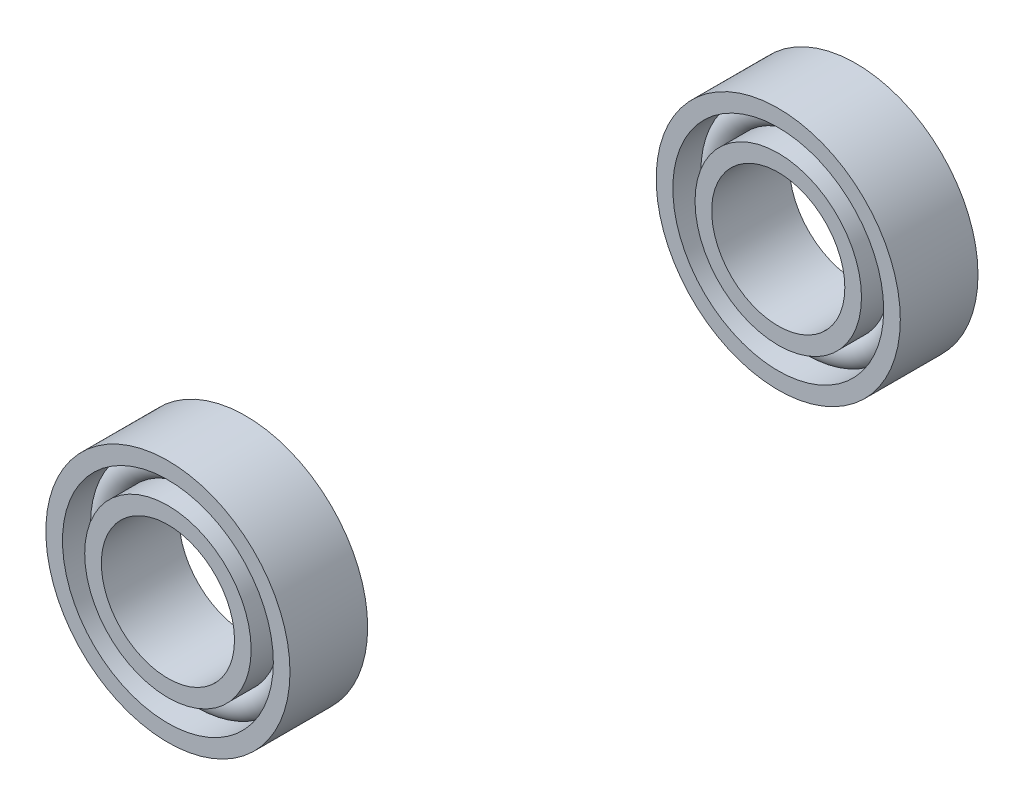
ISO-10303-21;
HEADER;
FILE_DESCRIPTION(('STEP AP214'),'2;1');
FILE_NAME('part.step','',(''),(''),'','','');
FILE_SCHEMA(('AUTOMOTIVE_DESIGN { 1 0 10303 214 1 1 1 1 }'));
ENDSEC;
DATA;
#1=APPLICATION_CONTEXT('core data for automotive mechanical design processes');
#2=APPLICATION_PROTOCOL_DEFINITION('international standard','automotive_design',2000,#1);
#3=PRODUCT_CONTEXT('',#1,'mechanical');
#4=PRODUCT('Part','Part','',(#3));
#5=PRODUCT_RELATED_PRODUCT_CATEGORY('part','',(#4));
#6=PRODUCT_DEFINITION_FORMATION('','',#4);
#7=PRODUCT_DEFINITION_CONTEXT('part definition',#1,'design');
#8=PRODUCT_DEFINITION('design','',#6,#7);
#9=PRODUCT_DEFINITION_SHAPE('','',#8);
#10=(LENGTH_UNIT() NAMED_UNIT(*) SI_UNIT(.MILLI.,.METRE.));
#11=(NAMED_UNIT(*) PLANE_ANGLE_UNIT() SI_UNIT($,.RADIAN.));
#12=(NAMED_UNIT(*) SI_UNIT($,.STERADIAN.) SOLID_ANGLE_UNIT());
#13=UNCERTAINTY_MEASURE_WITH_UNIT(LENGTH_MEASURE(1.E-05),#10,'distance_accuracy_value','');
#14=(GEOMETRIC_REPRESENTATION_CONTEXT(3) GLOBAL_UNCERTAINTY_ASSIGNED_CONTEXT((#13)) GLOBAL_UNIT_ASSIGNED_CONTEXT((#10,
#11,#12)) REPRESENTATION_CONTEXT('',''));
#15=CARTESIAN_POINT('',(0.,0.,0.));
#16=DIRECTION('',(0.,0.,1.));
#17=DIRECTION('',(1.,0.,0.));
#18=AXIS2_PLACEMENT_3D('',#15,#16,#17);
#19=CARTESIAN_POINT('',(-172.5,0.,-143.));
#20=DIRECTION('',(0.,0.,1.));
#21=DIRECTION('',(1.,0.,0.));
#22=AXIS2_PLACEMENT_3D('',#19,#20,#21);
#23=TOROIDAL_SURFACE('',#22,8.50000000000001,1.40000000000001);
#24=CARTESIAN_POINT('',(-172.5,0.,-142.020204102887));
#25=DIRECTION('',(0.,0.,-1.));
#26=DIRECTION('',(-1.,0.,0.));
#27=AXIS2_PLACEMENT_3D('',#24,#25,#26);
#28=CIRCLE('',#27,7.50000000000001);
#29=CARTESIAN_POINT('',(-180.,0.,-142.020204102887));
#30=VERTEX_POINT('',#29);
#31=EDGE_CURVE('E50',#30,#30,#28,.T.);
#32=ORIENTED_EDGE('',*,*,#31,.T.);
#33=EDGE_LOOP('',(#32));
#34=FACE_BOUND('',#33,.T.);
#35=CARTESIAN_POINT('',(-172.5,0.,-142.020204102887));
#36=DIRECTION('',(0.,0.,-1.));
#37=DIRECTION('',(-1.,0.,0.));
#38=AXIS2_PLACEMENT_3D('',#35,#36,#37);
#39=CIRCLE('',#38,9.50000000000001);
#40=CARTESIAN_POINT('',(-182.,0.,-142.020204102887));
#41=VERTEX_POINT('',#40);
#42=EDGE_CURVE('E11',#41,#41,#39,.T.);
#43=ORIENTED_EDGE('',*,*,#42,.F.);
#44=EDGE_LOOP('',(#43));
#45=FACE_BOUND('',#44,.T.);
#46=ADVANCED_FACE('F39',(#34,#45),#23,.T.);
#47=CARTESIAN_POINT('',(-172.5,0.,-143.979795897113));
#48=DIRECTION('',(0.,0.,1.));
#49=DIRECTION('',(1.,0.,0.));
#50=AXIS2_PLACEMENT_3D('',#47,#48,#49);
#51=CIRCLE('',#50,7.50000000000001);
#52=CARTESIAN_POINT('',(-165.,0.,-143.979795897113));
#53=VERTEX_POINT('',#52);
#54=EDGE_CURVE('E54',#53,#53,#51,.T.);
#55=ORIENTED_EDGE('',*,*,#54,.T.);
#56=EDGE_LOOP('',(#55));
#57=FACE_BOUND('',#56,.T.);
#58=CARTESIAN_POINT('',(-172.5,0.,-143.979795897113));
#59=DIRECTION('',(0.,0.,1.));
#60=DIRECTION('',(1.,0.,0.));
#61=AXIS2_PLACEMENT_3D('',#58,#59,#60);
#62=CIRCLE('',#61,9.50000000000001);
#63=CARTESIAN_POINT('',(-163.,0.,-143.979795897113));
#64=VERTEX_POINT('',#63);
#65=EDGE_CURVE('E46',#64,#64,#62,.T.);
#66=ORIENTED_EDGE('',*,*,#65,.F.);
#67=EDGE_LOOP('',(#66));
#68=FACE_BOUND('',#67,.T.);
#69=ADVANCED_FACE('F102',(#57,#68),#23,.T.);
#70=CARTESIAN_POINT('',(-172.5,0.,-134.5));
#71=DIRECTION('',(0.,0.,1.));
#72=DIRECTION('',(1.,0.,0.));
#73=AXIS2_PLACEMENT_3D('',#70,#71,#72);
#74=CYLINDRICAL_SURFACE('',#73,7.50000000000001);
#75=CARTESIAN_POINT('',(-172.5,0.,-139.5));
#76=DIRECTION('',(0.,0.,1.));
#77=DIRECTION('',(1.,0.,0.));
#78=AXIS2_PLACEMENT_3D('',#75,#76,#77);
#79=CIRCLE('',#78,7.50000000000001);
#80=CARTESIAN_POINT('',(-165.,0.,-139.5));
#81=VERTEX_POINT('',#80);
#82=EDGE_CURVE('E62',#81,#81,#79,.T.);
#83=ORIENTED_EDGE('',*,*,#82,.F.);
#84=EDGE_LOOP('',(#83));
#85=FACE_BOUND('',#84,.T.);
#86=ORIENTED_EDGE('',*,*,#31,.F.);
#87=EDGE_LOOP('',(#86));
#88=FACE_BOUND('',#87,.T.);
#89=ADVANCED_FACE('F107',(#85,#88),#74,.T.);
#90=CARTESIAN_POINT('',(-172.5,0.,-146.5));
#91=DIRECTION('',(0.,0.,1.));
#92=DIRECTION('',(1.,0.,0.));
#93=AXIS2_PLACEMENT_3D('',#90,#91,#92);
#94=CIRCLE('',#93,7.50000000000001);
#95=CARTESIAN_POINT('',(-165.,0.,-146.5));
#96=VERTEX_POINT('',#95);
#97=EDGE_CURVE('E65',#96,#96,#94,.T.);
#98=ORIENTED_EDGE('',*,*,#97,.T.);
#99=EDGE_LOOP('',(#98));
#100=FACE_BOUND('',#99,.T.);
#101=ORIENTED_EDGE('',*,*,#54,.F.);
#102=EDGE_LOOP('',(#101));
#103=FACE_BOUND('',#102,.T.);
#104=ADVANCED_FACE('F116',(#100,#103),#74,.T.);
#105=CARTESIAN_POINT('',(-172.5,0.,-134.5));
#106=DIRECTION('',(0.,0.,1.));
#107=DIRECTION('',(1.,0.,0.));
#108=AXIS2_PLACEMENT_3D('',#105,#106,#107);
#109=CYLINDRICAL_SURFACE('',#108,6.00000000000001);
#110=CARTESIAN_POINT('',(-172.5,0.,-146.5));
#111=DIRECTION('',(0.,0.,1.));
#112=DIRECTION('',(1.,0.,0.));
#113=AXIS2_PLACEMENT_3D('',#110,#111,#112);
#114=CIRCLE('',#113,6.00000000000001);
#115=CARTESIAN_POINT('',(-166.5,0.,-146.5));
#116=VERTEX_POINT('',#115);
#117=EDGE_CURVE('E68',#116,#116,#114,.T.);
#118=ORIENTED_EDGE('',*,*,#117,.F.);
#119=EDGE_LOOP('',(#118));
#120=FACE_BOUND('',#119,.T.);
#121=CARTESIAN_POINT('',(-172.5,0.,-139.5));
#122=DIRECTION('',(0.,0.,1.));
#123=DIRECTION('',(1.,0.,0.));
#124=AXIS2_PLACEMENT_3D('',#121,#122,#123);
#125=CIRCLE('',#124,6.00000000000001);
#126=CARTESIAN_POINT('',(-166.5,0.,-139.5));
#127=VERTEX_POINT('',#126);
#128=EDGE_CURVE('E59',#127,#127,#125,.T.);
#129=ORIENTED_EDGE('',*,*,#128,.T.);
#130=EDGE_LOOP('',(#129));
#131=FACE_BOUND('',#130,.T.);
#132=ADVANCED_FACE('F41',(#120,#131),#109,.F.);
#133=CARTESIAN_POINT('',(-178.5,0.,-139.5));
#134=DIRECTION('',(0.,0.,-1.));
#135=DIRECTION('',(-1.,0.,0.));
#136=AXIS2_PLACEMENT_3D('',#133,#134,#135);
#137=PLANE('',#136);
#138=ORIENTED_EDGE('',*,*,#128,.F.);
#139=EDGE_LOOP('',(#138));
#140=FACE_BOUND('',#139,.T.);
#141=ORIENTED_EDGE('',*,*,#82,.T.);
#142=EDGE_LOOP('',(#141));
#143=FACE_BOUND('',#142,.T.);
#144=ADVANCED_FACE('F113',(#140,#143),#137,.F.);
#145=CARTESIAN_POINT('',(-180.,0.,-146.5));
#146=DIRECTION('',(0.,0.,1.));
#147=DIRECTION('',(1.,0.,0.));
#148=AXIS2_PLACEMENT_3D('',#145,#146,#147);
#149=PLANE('',#148);
#150=ORIENTED_EDGE('',*,*,#97,.F.);
#151=EDGE_LOOP('',(#150));
#152=FACE_BOUND('',#151,.T.);
#153=ORIENTED_EDGE('',*,*,#117,.T.);
#154=EDGE_LOOP('',(#153));
#155=FACE_BOUND('',#154,.T.);
#156=ADVANCED_FACE('F98',(#152,#155),#149,.F.);
#157=CARTESIAN_POINT('',(-172.5,0.,-134.5));
#158=DIRECTION('',(0.,0.,1.));
#159=DIRECTION('',(1.,0.,0.));
#160=AXIS2_PLACEMENT_3D('',#157,#158,#159);
#161=CYLINDRICAL_SURFACE('',#160,9.50000000000001);
#162=CARTESIAN_POINT('',(-172.5,0.,-139.5));
#163=DIRECTION('',(0.,0.,1.));
#164=DIRECTION('',(1.,0.,0.));
#165=AXIS2_PLACEMENT_3D('',#162,#163,#164);
#166=CIRCLE('',#165,9.50000000000001);
#167=CARTESIAN_POINT('',(-163.,0.,-139.5));
#168=VERTEX_POINT('',#167);
#169=EDGE_CURVE('E71',#168,#168,#166,.T.);
#170=ORIENTED_EDGE('',*,*,#169,.T.);
#171=EDGE_LOOP('',(#170));
#172=FACE_BOUND('',#171,.T.);
#173=ORIENTED_EDGE('',*,*,#42,.T.);
#174=EDGE_LOOP('',(#173));
#175=FACE_BOUND('',#174,.T.);
#176=ADVANCED_FACE('F89',(#172,#175),#161,.F.);
#177=CARTESIAN_POINT('',(-172.5,0.,-146.5));
#178=DIRECTION('',(0.,0.,1.));
#179=DIRECTION('',(1.,0.,0.));
#180=AXIS2_PLACEMENT_3D('',#177,#178,#179);
#181=CIRCLE('',#180,9.50000000000001);
#182=CARTESIAN_POINT('',(-163.,0.,-146.5));
#183=VERTEX_POINT('',#182);
#184=EDGE_CURVE('E80',#183,#183,#181,.T.);
#185=ORIENTED_EDGE('',*,*,#184,.F.);
#186=EDGE_LOOP('',(#185));
#187=FACE_BOUND('',#186,.T.);
#188=ORIENTED_EDGE('',*,*,#65,.T.);
#189=EDGE_LOOP('',(#188));
#190=FACE_BOUND('',#189,.T.);
#191=ADVANCED_FACE('F86',(#187,#190),#161,.F.);
#192=CARTESIAN_POINT('',(-182.,0.,-139.5));
#193=DIRECTION('',(0.,0.,-1.));
#194=DIRECTION('',(-1.,0.,0.));
#195=AXIS2_PLACEMENT_3D('',#192,#193,#194);
#196=PLANE('',#195);
#197=ORIENTED_EDGE('',*,*,#169,.F.);
#198=EDGE_LOOP('',(#197));
#199=FACE_BOUND('',#198,.T.);
#200=CARTESIAN_POINT('',(-172.5,0.,-139.5));
#201=DIRECTION('',(0.,0.,1.));
#202=DIRECTION('',(1.,0.,0.));
#203=AXIS2_PLACEMENT_3D('',#200,#201,#202);
#204=CIRCLE('',#203,11.);
#205=CARTESIAN_POINT('',(-161.5,0.,-139.5));
#206=VERTEX_POINT('',#205);
#207=EDGE_CURVE('E74',#206,#206,#204,.T.);
#208=ORIENTED_EDGE('',*,*,#207,.T.);
#209=EDGE_LOOP('',(#208));
#210=FACE_BOUND('',#209,.T.);
#211=ADVANCED_FACE('F88',(#199,#210),#196,.F.);
#212=CARTESIAN_POINT('',(-172.5,0.,-134.5));
#213=DIRECTION('',(0.,0.,1.));
#214=DIRECTION('',(1.,0.,0.));
#215=AXIS2_PLACEMENT_3D('',#212,#213,#214);
#216=CYLINDRICAL_SURFACE('',#215,11.);
#217=ORIENTED_EDGE('',*,*,#207,.F.);
#218=EDGE_LOOP('',(#217));
#219=FACE_BOUND('',#218,.T.);
#220=CARTESIAN_POINT('',(-172.5,0.,-146.5));
#221=DIRECTION('',(0.,0.,1.));
#222=DIRECTION('',(1.,0.,0.));
#223=AXIS2_PLACEMENT_3D('',#220,#221,#222);
#224=CIRCLE('',#223,11.);
#225=CARTESIAN_POINT('',(-161.5,0.,-146.5));
#226=VERTEX_POINT('',#225);
#227=EDGE_CURVE('E77',#226,#226,#224,.T.);
#228=ORIENTED_EDGE('',*,*,#227,.T.);
#229=EDGE_LOOP('',(#228));
#230=FACE_BOUND('',#229,.T.);
#231=ADVANCED_FACE('F95',(#219,#230),#216,.T.);
#232=CARTESIAN_POINT('',(-183.5,0.,-146.5));
#233=DIRECTION('',(0.,0.,1.));
#234=DIRECTION('',(1.,0.,0.));
#235=AXIS2_PLACEMENT_3D('',#232,#233,#234);
#236=PLANE('',#235);
#237=ORIENTED_EDGE('',*,*,#227,.F.);
#238=EDGE_LOOP('',(#237));
#239=FACE_BOUND('',#238,.T.);
#240=ORIENTED_EDGE('',*,*,#184,.T.);
#241=EDGE_LOOP('',(#240));
#242=FACE_BOUND('',#241,.T.);
#243=ADVANCED_FACE('F84',(#239,#242),#236,.F.);
#244=CLOSED_SHELL('',(#46,#69,#89,#104,#132,#144,#156,#176,#191,#211,#231,#243));
#245=MANIFOLD_SOLID_BREP('B2',#244);
#246=CARTESIAN_POINT('',(-172.5,0.,-88.));
#247=DIRECTION('',(0.,0.,1.));
#248=DIRECTION('',(1.,0.,0.));
#249=AXIS2_PLACEMENT_3D('',#246,#247,#248);
#250=TOROIDAL_SURFACE('',#249,8.50000000000001,1.40000000000001);
#251=CARTESIAN_POINT('',(-172.5,0.,-87.0202041028867));
#252=DIRECTION('',(0.,0.,-1.));
#253=DIRECTION('',(-1.,0.,0.));
#254=AXIS2_PLACEMENT_3D('',#251,#252,#253);
#255=CIRCLE('',#254,7.50000000000001);
#256=CARTESIAN_POINT('',(-180.,0.,-87.0202041028867));
#257=VERTEX_POINT('',#256);
#258=EDGE_CURVE('E229',#257,#257,#255,.T.);
#259=ORIENTED_EDGE('',*,*,#258,.T.);
#260=EDGE_LOOP('',(#259));
#261=FACE_BOUND('',#260,.T.);
#262=CARTESIAN_POINT('',(-172.5,0.,-87.0202041028867));
#263=DIRECTION('',(0.,0.,-1.));
#264=DIRECTION('',(-1.,0.,0.));
#265=AXIS2_PLACEMENT_3D('',#262,#263,#264);
#266=CIRCLE('',#265,9.50000000000001);
#267=CARTESIAN_POINT('',(-182.,0.,-87.0202041028867));
#268=VERTEX_POINT('',#267);
#269=EDGE_CURVE('E38',#268,#268,#266,.T.);
#270=ORIENTED_EDGE('',*,*,#269,.F.);
#271=EDGE_LOOP('',(#270));
#272=FACE_BOUND('',#271,.T.);
#273=ADVANCED_FACE('F218',(#261,#272),#250,.T.);
#274=CARTESIAN_POINT('',(-172.5,0.,-88.9797958971133));
#275=DIRECTION('',(0.,0.,1.));
#276=DIRECTION('',(1.,0.,0.));
#277=AXIS2_PLACEMENT_3D('',#274,#275,#276);
#278=CIRCLE('',#277,7.50000000000001);
#279=CARTESIAN_POINT('',(-165.,0.,-88.9797958971133));
#280=VERTEX_POINT('',#279);
#281=EDGE_CURVE('E233',#280,#280,#278,.T.);
#282=ORIENTED_EDGE('',*,*,#281,.T.);
#283=EDGE_LOOP('',(#282));
#284=FACE_BOUND('',#283,.T.);
#285=CARTESIAN_POINT('',(-172.5,0.,-88.9797958971133));
#286=DIRECTION('',(0.,0.,1.));
#287=DIRECTION('',(1.,0.,0.));
#288=AXIS2_PLACEMENT_3D('',#285,#286,#287);
#289=CIRCLE('',#288,9.50000000000001);
#290=CARTESIAN_POINT('',(-163.,0.,-88.9797958971133));
#291=VERTEX_POINT('',#290);
#292=EDGE_CURVE('E225',#291,#291,#289,.T.);
#293=ORIENTED_EDGE('',*,*,#292,.F.);
#294=EDGE_LOOP('',(#293));
#295=FACE_BOUND('',#294,.T.);
#296=ADVANCED_FACE('F281',(#284,#295),#250,.T.);
#297=CARTESIAN_POINT('',(-172.5,0.,-79.5));
#298=DIRECTION('',(0.,0.,1.));
#299=DIRECTION('',(1.,0.,0.));
#300=AXIS2_PLACEMENT_3D('',#297,#298,#299);
#301=CYLINDRICAL_SURFACE('',#300,7.50000000000001);
#302=CARTESIAN_POINT('',(-172.5,0.,-84.5));
#303=DIRECTION('',(0.,0.,1.));
#304=DIRECTION('',(1.,0.,0.));
#305=AXIS2_PLACEMENT_3D('',#302,#303,#304);
#306=CIRCLE('',#305,7.50000000000001);
#307=CARTESIAN_POINT('',(-165.,0.,-84.5));
#308=VERTEX_POINT('',#307);
#309=EDGE_CURVE('E241',#308,#308,#306,.T.);
#310=ORIENTED_EDGE('',*,*,#309,.F.);
#311=EDGE_LOOP('',(#310));
#312=FACE_BOUND('',#311,.T.);
#313=ORIENTED_EDGE('',*,*,#258,.F.);
#314=EDGE_LOOP('',(#313));
#315=FACE_BOUND('',#314,.T.);
#316=ADVANCED_FACE('F286',(#312,#315),#301,.T.);
#317=CARTESIAN_POINT('',(-172.5,0.,-91.5));
#318=DIRECTION('',(0.,0.,1.));
#319=DIRECTION('',(1.,0.,0.));
#320=AXIS2_PLACEMENT_3D('',#317,#318,#319);
#321=CIRCLE('',#320,7.50000000000001);
#322=CARTESIAN_POINT('',(-165.,0.,-91.5));
#323=VERTEX_POINT('',#322);
#324=EDGE_CURVE('E244',#323,#323,#321,.T.);
#325=ORIENTED_EDGE('',*,*,#324,.T.);
#326=EDGE_LOOP('',(#325));
#327=FACE_BOUND('',#326,.T.);
#328=ORIENTED_EDGE('',*,*,#281,.F.);
#329=EDGE_LOOP('',(#328));
#330=FACE_BOUND('',#329,.T.);
#331=ADVANCED_FACE('F295',(#327,#330),#301,.T.);
#332=CARTESIAN_POINT('',(-172.5,0.,-79.5));
#333=DIRECTION('',(0.,0.,1.));
#334=DIRECTION('',(1.,0.,0.));
#335=AXIS2_PLACEMENT_3D('',#332,#333,#334);
#336=CYLINDRICAL_SURFACE('',#335,6.00000000000001);
#337=CARTESIAN_POINT('',(-172.5,0.,-91.5));
#338=DIRECTION('',(0.,0.,1.));
#339=DIRECTION('',(1.,0.,0.));
#340=AXIS2_PLACEMENT_3D('',#337,#338,#339);
#341=CIRCLE('',#340,6.00000000000001);
#342=CARTESIAN_POINT('',(-166.5,0.,-91.5));
#343=VERTEX_POINT('',#342);
#344=EDGE_CURVE('E247',#343,#343,#341,.T.);
#345=ORIENTED_EDGE('',*,*,#344,.F.);
#346=EDGE_LOOP('',(#345));
#347=FACE_BOUND('',#346,.T.);
#348=CARTESIAN_POINT('',(-172.5,0.,-84.5));
#349=DIRECTION('',(0.,0.,1.));
#350=DIRECTION('',(1.,0.,0.));
#351=AXIS2_PLACEMENT_3D('',#348,#349,#350);
#352=CIRCLE('',#351,6.00000000000001);
#353=CARTESIAN_POINT('',(-166.5,0.,-84.5));
#354=VERTEX_POINT('',#353);
#355=EDGE_CURVE('E238',#354,#354,#352,.T.);
#356=ORIENTED_EDGE('',*,*,#355,.T.);
#357=EDGE_LOOP('',(#356));
#358=FACE_BOUND('',#357,.T.);
#359=ADVANCED_FACE('F220',(#347,#358),#336,.F.);
#360=CARTESIAN_POINT('',(-178.5,0.,-84.5));
#361=DIRECTION('',(0.,0.,-1.));
#362=DIRECTION('',(-1.,0.,0.));
#363=AXIS2_PLACEMENT_3D('',#360,#361,#362);
#364=PLANE('',#363);
#365=ORIENTED_EDGE('',*,*,#355,.F.);
#366=EDGE_LOOP('',(#365));
#367=FACE_BOUND('',#366,.T.);
#368=ORIENTED_EDGE('',*,*,#309,.T.);
#369=EDGE_LOOP('',(#368));
#370=FACE_BOUND('',#369,.T.);
#371=ADVANCED_FACE('F292',(#367,#370),#364,.F.);
#372=CARTESIAN_POINT('',(-180.,0.,-91.5));
#373=DIRECTION('',(0.,0.,1.));
#374=DIRECTION('',(1.,0.,0.));
#375=AXIS2_PLACEMENT_3D('',#372,#373,#374);
#376=PLANE('',#375);
#377=ORIENTED_EDGE('',*,*,#324,.F.);
#378=EDGE_LOOP('',(#377));
#379=FACE_BOUND('',#378,.T.);
#380=ORIENTED_EDGE('',*,*,#344,.T.);
#381=EDGE_LOOP('',(#380));
#382=FACE_BOUND('',#381,.T.);
#383=ADVANCED_FACE('F277',(#379,#382),#376,.F.);
#384=CARTESIAN_POINT('',(-172.5,0.,-79.5));
#385=DIRECTION('',(0.,0.,1.));
#386=DIRECTION('',(1.,0.,0.));
#387=AXIS2_PLACEMENT_3D('',#384,#385,#386);
#388=CYLINDRICAL_SURFACE('',#387,9.50000000000001);
#389=CARTESIAN_POINT('',(-172.5,0.,-84.5));
#390=DIRECTION('',(0.,0.,1.));
#391=DIRECTION('',(1.,0.,0.));
#392=AXIS2_PLACEMENT_3D('',#389,#390,#391);
#393=CIRCLE('',#392,9.50000000000001);
#394=CARTESIAN_POINT('',(-163.,0.,-84.5));
#395=VERTEX_POINT('',#394);
#396=EDGE_CURVE('E250',#395,#395,#393,.T.);
#397=ORIENTED_EDGE('',*,*,#396,.T.);
#398=EDGE_LOOP('',(#397));
#399=FACE_BOUND('',#398,.T.);
#400=ORIENTED_EDGE('',*,*,#269,.T.);
#401=EDGE_LOOP('',(#400));
#402=FACE_BOUND('',#401,.T.);
#403=ADVANCED_FACE('F268',(#399,#402),#388,.F.);
#404=CARTESIAN_POINT('',(-172.5,0.,-91.5));
#405=DIRECTION('',(0.,0.,1.));
#406=DIRECTION('',(1.,0.,0.));
#407=AXIS2_PLACEMENT_3D('',#404,#405,#406);
#408=CIRCLE('',#407,9.50000000000001);
#409=CARTESIAN_POINT('',(-163.,0.,-91.5));
#410=VERTEX_POINT('',#409);
#411=EDGE_CURVE('E259',#410,#410,#408,.T.);
#412=ORIENTED_EDGE('',*,*,#411,.F.);
#413=EDGE_LOOP('',(#412));
#414=FACE_BOUND('',#413,.T.);
#415=ORIENTED_EDGE('',*,*,#292,.T.);
#416=EDGE_LOOP('',(#415));
#417=FACE_BOUND('',#416,.T.);
#418=ADVANCED_FACE('F265',(#414,#417),#388,.F.);
#419=CARTESIAN_POINT('',(-182.,0.,-84.5));
#420=DIRECTION('',(0.,0.,-1.));
#421=DIRECTION('',(-1.,0.,0.));
#422=AXIS2_PLACEMENT_3D('',#419,#420,#421);
#423=PLANE('',#422);
#424=ORIENTED_EDGE('',*,*,#396,.F.);
#425=EDGE_LOOP('',(#424));
#426=FACE_BOUND('',#425,.T.);
#427=CARTESIAN_POINT('',(-172.5,0.,-84.5));
#428=DIRECTION('',(0.,0.,1.));
#429=DIRECTION('',(1.,0.,0.));
#430=AXIS2_PLACEMENT_3D('',#427,#428,#429);
#431=CIRCLE('',#430,11.);
#432=CARTESIAN_POINT('',(-161.5,0.,-84.5));
#433=VERTEX_POINT('',#432);
#434=EDGE_CURVE('E253',#433,#433,#431,.T.);
#435=ORIENTED_EDGE('',*,*,#434,.T.);
#436=EDGE_LOOP('',(#435));
#437=FACE_BOUND('',#436,.T.);
#438=ADVANCED_FACE('F267',(#426,#437),#423,.F.);
#439=CARTESIAN_POINT('',(-172.5,0.,-79.5));
#440=DIRECTION('',(0.,0.,1.));
#441=DIRECTION('',(1.,0.,0.));
#442=AXIS2_PLACEMENT_3D('',#439,#440,#441);
#443=CYLINDRICAL_SURFACE('',#442,11.);
#444=ORIENTED_EDGE('',*,*,#434,.F.);
#445=EDGE_LOOP('',(#444));
#446=FACE_BOUND('',#445,.T.);
#447=CARTESIAN_POINT('',(-172.5,0.,-91.5));
#448=DIRECTION('',(0.,0.,1.));
#449=DIRECTION('',(1.,0.,0.));
#450=AXIS2_PLACEMENT_3D('',#447,#448,#449);
#451=CIRCLE('',#450,11.);
#452=CARTESIAN_POINT('',(-161.5,0.,-91.5));
#453=VERTEX_POINT('',#452);
#454=EDGE_CURVE('E256',#453,#453,#451,.T.);
#455=ORIENTED_EDGE('',*,*,#454,.T.);
#456=EDGE_LOOP('',(#455));
#457=FACE_BOUND('',#456,.T.);
#458=ADVANCED_FACE('F274',(#446,#457),#443,.T.);
#459=CARTESIAN_POINT('',(-183.5,0.,-91.5));
#460=DIRECTION('',(0.,0.,1.));
#461=DIRECTION('',(1.,0.,0.));
#462=AXIS2_PLACEMENT_3D('',#459,#460,#461);
#463=PLANE('',#462);
#464=ORIENTED_EDGE('',*,*,#454,.F.);
#465=EDGE_LOOP('',(#464));
#466=FACE_BOUND('',#465,.T.);
#467=ORIENTED_EDGE('',*,*,#411,.T.);
#468=EDGE_LOOP('',(#467));
#469=FACE_BOUND('',#468,.T.);
#470=ADVANCED_FACE('F263',(#466,#469),#463,.F.);
#471=CLOSED_SHELL('',(#273,#296,#316,#331,#359,#371,#383,#403,#418,#438,#458,#470));
#472=MANIFOLD_SOLID_BREP('B6',#471);
#473=ADVANCED_BREP_SHAPE_REPRESENTATION('',(#18,#245,#472),#14);
#474=SHAPE_DEFINITION_REPRESENTATION(#9,#473);
ENDSEC;
END-ISO-10303-21;
